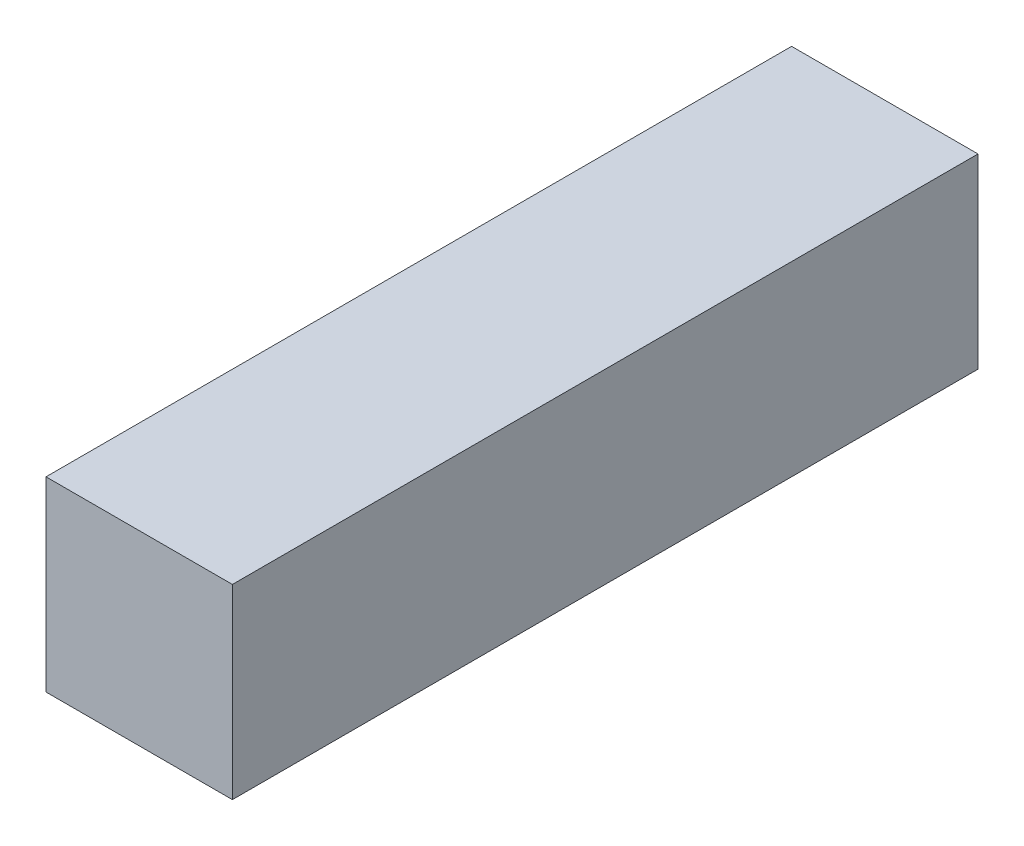
ISO-10303-21;
HEADER;
FILE_DESCRIPTION(('STEP AP214'),'2;1');
FILE_NAME('part.step','',(''),(''),'','','');
FILE_SCHEMA(('AUTOMOTIVE_DESIGN { 1 0 10303 214 1 1 1 1 }'));
ENDSEC;
DATA;
#1=APPLICATION_CONTEXT('core data for automotive mechanical design processes');
#2=APPLICATION_PROTOCOL_DEFINITION('international standard','automotive_design',2000,#1);
#3=PRODUCT_CONTEXT('',#1,'mechanical');
#4=PRODUCT('Part','Part','',(#3));
#5=PRODUCT_RELATED_PRODUCT_CATEGORY('part','',(#4));
#6=PRODUCT_DEFINITION_FORMATION('','',#4);
#7=PRODUCT_DEFINITION_CONTEXT('part definition',#1,'design');
#8=PRODUCT_DEFINITION('design','',#6,#7);
#9=PRODUCT_DEFINITION_SHAPE('','',#8);
#10=(LENGTH_UNIT() NAMED_UNIT(*) SI_UNIT(.MILLI.,.METRE.));
#11=(NAMED_UNIT(*) PLANE_ANGLE_UNIT() SI_UNIT($,.RADIAN.));
#12=(NAMED_UNIT(*) SI_UNIT($,.STERADIAN.) SOLID_ANGLE_UNIT());
#13=UNCERTAINTY_MEASURE_WITH_UNIT(LENGTH_MEASURE(1.E-05),#10,'distance_accuracy_value','');
#14=(GEOMETRIC_REPRESENTATION_CONTEXT(3) GLOBAL_UNCERTAINTY_ASSIGNED_CONTEXT((#13)) GLOBAL_UNIT_ASSIGNED_CONTEXT((#10,
#11,#12)) REPRESENTATION_CONTEXT('',''));
#15=CARTESIAN_POINT('',(0.,0.,0.));
#16=DIRECTION('',(0.,0.,1.));
#17=DIRECTION('',(1.,0.,0.));
#18=AXIS2_PLACEMENT_3D('',#15,#16,#17);
#19=CARTESIAN_POINT('',(-1.74999999999944,1.24999999999949,12.));
#20=DIRECTION('',(0.,-1.,0.));
#21=DIRECTION('',(0.,0.,-1.));
#22=AXIS2_PLACEMENT_3D('',#19,#20,#21);
#23=PLANE('',#22);
#24=DIRECTION('',(-1.,0.,0.));
#25=VECTOR('',#24,1.);
#26=CARTESIAN_POINT('',(-1.74999999999944,1.24999999999949,0.));
#27=LINE('',#26,#25);
#28=CARTESIAN_POINT('',(-1.74999999999944,1.24999999999949,0.));
#29=VERTEX_POINT('',#28);
#30=CARTESIAN_POINT('',(-4.74999999999944,1.24999999999949,0.));
#31=VERTEX_POINT('',#30);
#32=EDGE_CURVE('E96',#29,#31,#27,.T.);
#33=ORIENTED_EDGE('',*,*,#32,.T.);
#34=DIRECTION('',(0.,0.,-1.));
#35=VECTOR('',#34,1.);
#36=CARTESIAN_POINT('',(-4.74999999999944,1.24999999999949,12.));
#37=LINE('',#36,#35);
#38=CARTESIAN_POINT('',(-4.74999999999944,1.24999999999949,12.));
#39=VERTEX_POINT('',#38);
#40=EDGE_CURVE('E11',#39,#31,#37,.T.);
#41=ORIENTED_EDGE('',*,*,#40,.F.);
#42=DIRECTION('',(-1.,0.,0.));
#43=VECTOR('',#42,1.);
#44=CARTESIAN_POINT('',(-1.74999999999944,1.24999999999949,12.));
#45=LINE('',#44,#43);
#46=CARTESIAN_POINT('',(-1.74999999999944,1.24999999999949,12.));
#47=VERTEX_POINT('',#46);
#48=EDGE_CURVE('E84',#47,#39,#45,.T.);
#49=ORIENTED_EDGE('',*,*,#48,.F.);
#50=DIRECTION('',(0.,0.,-1.));
#51=VECTOR('',#50,1.);
#52=CARTESIAN_POINT('',(-1.74999999999944,1.24999999999949,12.));
#53=LINE('',#52,#51);
#54=EDGE_CURVE('E92',#47,#29,#53,.T.);
#55=ORIENTED_EDGE('',*,*,#54,.T.);
#56=EDGE_LOOP('',(#33,#41,#49,#55));
#57=FACE_BOUND('',#56,.T.);
#58=ADVANCED_FACE('F33',(#57),#23,.F.);
#59=CARTESIAN_POINT('',(-4.74999999999944,1.24999999999949,12.));
#60=DIRECTION('',(1.,0.,0.));
#61=DIRECTION('',(0.,0.,-1.));
#62=AXIS2_PLACEMENT_3D('',#59,#60,#61);
#63=PLANE('',#62);
#64=DIRECTION('',(0.,-1.,0.));
#65=VECTOR('',#64,1.);
#66=CARTESIAN_POINT('',(-4.74999999999944,1.24999999999949,0.));
#67=LINE('',#66,#65);
#68=CARTESIAN_POINT('',(-4.74999999999944,-1.75000000000051,0.));
#69=VERTEX_POINT('',#68);
#70=EDGE_CURVE('E88',#31,#69,#67,.T.);
#71=ORIENTED_EDGE('',*,*,#70,.T.);
#72=DIRECTION('',(0.,0.,-1.));
#73=VECTOR('',#72,1.);
#74=CARTESIAN_POINT('',(-4.74999999999944,-1.75000000000051,12.));
#75=LINE('',#74,#73);
#76=CARTESIAN_POINT('',(-4.74999999999944,-1.75000000000051,12.));
#77=VERTEX_POINT('',#76);
#78=EDGE_CURVE('E41',#77,#69,#75,.T.);
#79=ORIENTED_EDGE('',*,*,#78,.F.);
#80=DIRECTION('',(0.,-1.,0.));
#81=VECTOR('',#80,1.);
#82=CARTESIAN_POINT('',(-4.74999999999944,1.24999999999949,12.));
#83=LINE('',#82,#81);
#84=EDGE_CURVE('E79',#39,#77,#83,.T.);
#85=ORIENTED_EDGE('',*,*,#84,.F.);
#86=ORIENTED_EDGE('',*,*,#40,.T.);
#87=EDGE_LOOP('',(#71,#79,#85,#86));
#88=FACE_BOUND('',#87,.T.);
#89=ADVANCED_FACE('F87',(#88),#63,.F.);
#90=CARTESIAN_POINT('',(-4.74999999999944,-1.75000000000051,12.));
#91=DIRECTION('',(0.,1.,0.));
#92=DIRECTION('',(0.,0.,1.));
#93=AXIS2_PLACEMENT_3D('',#90,#91,#92);
#94=PLANE('',#93);
#95=DIRECTION('',(1.,0.,0.));
#96=VECTOR('',#95,1.);
#97=CARTESIAN_POINT('',(-4.74999999999944,-1.75000000000051,0.));
#98=LINE('',#97,#96);
#99=CARTESIAN_POINT('',(-1.74999999999944,-1.75000000000051,0.));
#100=VERTEX_POINT('',#99);
#101=EDGE_CURVE('E66',#69,#100,#98,.T.);
#102=ORIENTED_EDGE('',*,*,#101,.T.);
#103=DIRECTION('',(0.,0.,-1.));
#104=VECTOR('',#103,1.);
#105=CARTESIAN_POINT('',(-1.74999999999944,-1.75000000000051,12.));
#106=LINE('',#105,#104);
#107=CARTESIAN_POINT('',(-1.74999999999944,-1.75000000000051,12.));
#108=VERTEX_POINT('',#107);
#109=EDGE_CURVE('E89',#108,#100,#106,.T.);
#110=ORIENTED_EDGE('',*,*,#109,.F.);
#111=DIRECTION('',(1.,0.,0.));
#112=VECTOR('',#111,1.);
#113=CARTESIAN_POINT('',(-4.74999999999944,-1.75000000000051,12.));
#114=LINE('',#113,#112);
#115=EDGE_CURVE('E82',#77,#108,#114,.T.);
#116=ORIENTED_EDGE('',*,*,#115,.F.);
#117=ORIENTED_EDGE('',*,*,#78,.T.);
#118=EDGE_LOOP('',(#102,#110,#116,#117));
#119=FACE_BOUND('',#118,.T.);
#120=ADVANCED_FACE('F90',(#119),#94,.F.);
#121=CARTESIAN_POINT('',(-1.74999999999944,-1.75000000000051,12.));
#122=DIRECTION('',(-1.,0.,0.));
#123=DIRECTION('',(0.,0.,1.));
#124=AXIS2_PLACEMENT_3D('',#121,#122,#123);
#125=PLANE('',#124);
#126=DIRECTION('',(0.,1.,0.));
#127=VECTOR('',#126,1.);
#128=CARTESIAN_POINT('',(-1.74999999999944,-1.75000000000051,0.));
#129=LINE('',#128,#127);
#130=EDGE_CURVE('E72',#100,#29,#129,.T.);
#131=ORIENTED_EDGE('',*,*,#130,.T.);
#132=ORIENTED_EDGE('',*,*,#54,.F.);
#133=DIRECTION('',(0.,1.,0.));
#134=VECTOR('',#133,1.);
#135=CARTESIAN_POINT('',(-1.74999999999944,-1.75000000000051,12.));
#136=LINE('',#135,#134);
#137=EDGE_CURVE('E49',#108,#47,#136,.T.);
#138=ORIENTED_EDGE('',*,*,#137,.F.);
#139=ORIENTED_EDGE('',*,*,#109,.T.);
#140=EDGE_LOOP('',(#131,#132,#138,#139));
#141=FACE_BOUND('',#140,.T.);
#142=ADVANCED_FACE('F103',(#141),#125,.F.);
#143=CARTESIAN_POINT('',(0.,0.,12.));
#144=DIRECTION('',(0.,0.,1.));
#145=DIRECTION('',(1.,0.,0.));
#146=AXIS2_PLACEMENT_3D('',#143,#144,#145);
#147=PLANE('',#146);
#148=ORIENTED_EDGE('',*,*,#48,.T.);
#149=ORIENTED_EDGE('',*,*,#84,.T.);
#150=ORIENTED_EDGE('',*,*,#115,.T.);
#151=ORIENTED_EDGE('',*,*,#137,.T.);
#152=EDGE_LOOP('',(#148,#149,#150,#151));
#153=FACE_BOUND('',#152,.T.);
#154=ADVANCED_FACE('F80',(#153),#147,.T.);
#155=CARTESIAN_POINT('',(0.,0.,0.));
#156=DIRECTION('',(0.,0.,1.));
#157=DIRECTION('',(1.,0.,0.));
#158=AXIS2_PLACEMENT_3D('',#155,#156,#157);
#159=PLANE('',#158);
#160=ORIENTED_EDGE('',*,*,#32,.F.);
#161=ORIENTED_EDGE('',*,*,#130,.F.);
#162=ORIENTED_EDGE('',*,*,#101,.F.);
#163=ORIENTED_EDGE('',*,*,#70,.F.);
#164=EDGE_LOOP('',(#160,#161,#162,#163));
#165=FACE_BOUND('',#164,.T.);
#166=ADVANCED_FACE('F106',(#165),#159,.F.);
#167=CLOSED_SHELL('',(#58,#89,#120,#142,#154,#166));
#168=MANIFOLD_SOLID_BREP('B2',#167);
#169=ADVANCED_BREP_SHAPE_REPRESENTATION('',(#18,#168),#14);
#170=SHAPE_DEFINITION_REPRESENTATION(#9,#169);
ENDSEC;
END-ISO-10303-21;
